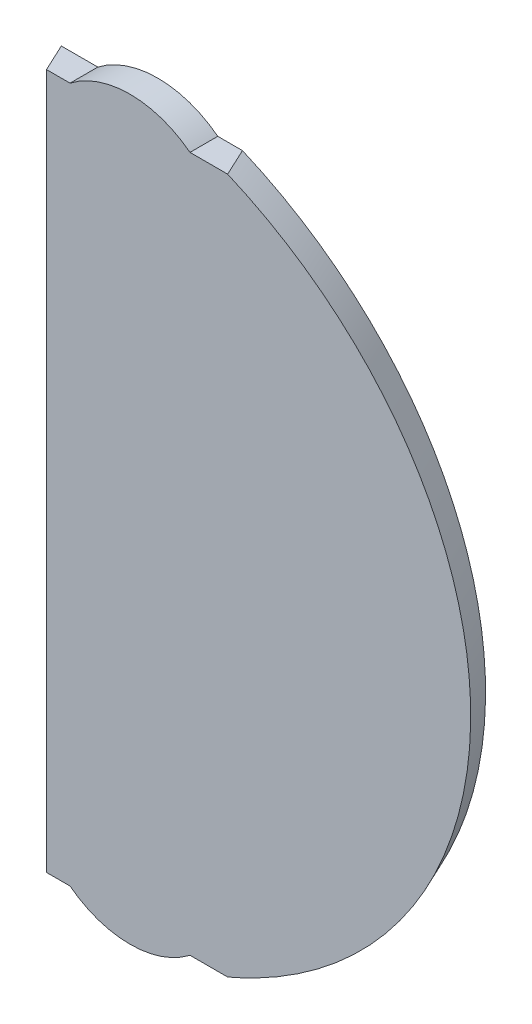
ISO-10303-21;
HEADER;
FILE_DESCRIPTION(('STEP AP214'),'2;1');
FILE_NAME('part.step','',(''),(''),'','','');
FILE_SCHEMA(('AUTOMOTIVE_DESIGN { 1 0 10303 214 1 1 1 1 }'));
ENDSEC;
DATA;
#1=APPLICATION_CONTEXT('core data for automotive mechanical design processes');
#2=APPLICATION_PROTOCOL_DEFINITION('international standard','automotive_design',2000,#1);
#3=PRODUCT_CONTEXT('',#1,'mechanical');
#4=PRODUCT('Part','Part','',(#3));
#5=PRODUCT_RELATED_PRODUCT_CATEGORY('part','',(#4));
#6=PRODUCT_DEFINITION_FORMATION('','',#4);
#7=PRODUCT_DEFINITION_CONTEXT('part definition',#1,'design');
#8=PRODUCT_DEFINITION('design','',#6,#7);
#9=PRODUCT_DEFINITION_SHAPE('','',#8);
#10=(LENGTH_UNIT() NAMED_UNIT(*) SI_UNIT(.MILLI.,.METRE.));
#11=(NAMED_UNIT(*) PLANE_ANGLE_UNIT() SI_UNIT($,.RADIAN.));
#12=(NAMED_UNIT(*) SI_UNIT($,.STERADIAN.) SOLID_ANGLE_UNIT());
#13=UNCERTAINTY_MEASURE_WITH_UNIT(LENGTH_MEASURE(1.E-05),#10,'distance_accuracy_value','');
#14=(GEOMETRIC_REPRESENTATION_CONTEXT(3) GLOBAL_UNCERTAINTY_ASSIGNED_CONTEXT((#13)) GLOBAL_UNIT_ASSIGNED_CONTEXT((#10,
#11,#12)) REPRESENTATION_CONTEXT('',''));
#15=CARTESIAN_POINT('',(0.,0.,0.));
#16=DIRECTION('',(0.,0.,1.));
#17=DIRECTION('',(1.,0.,0.));
#18=AXIS2_PLACEMENT_3D('',#15,#16,#17);
#19=CARTESIAN_POINT('',(10.4252922995726,10.795,0.431810345133612));
#20=DIRECTION('',(0.,-1.,0.));
#21=DIRECTION('',(-1.,0.,0.));
#22=AXIS2_PLACEMENT_3D('',#19,#20,#21);
#23=PLANE('',#22);
#24=DIRECTION('',(1.,0.,0.));
#25=VECTOR('',#24,1.);
#26=CARTESIAN_POINT('',(10.0225793579598,10.795,-0.431810345133612));
#27=LINE('',#26,#25);
#28=CARTESIAN_POINT('',(4.39823842454686,10.795,-0.431810345133612));
#29=VERTEX_POINT('',#28);
#30=CARTESIAN_POINT('',(5.53140935142909,10.795,-0.431810345133613));
#31=VERTEX_POINT('',#30);
#32=EDGE_CURVE('E126',#29,#31,#27,.T.);
#33=ORIENTED_EDGE('',*,*,#32,.F.);
#34=DIRECTION('',(-0.422618261740697,0.,-0.906307787036651));
#35=VECTOR('',#34,1.);
#36=CARTESIAN_POINT('',(4.80095136615957,10.795,0.431810345133612));
#37=LINE('',#36,#35);
#38=CARTESIAN_POINT('',(4.80095136615957,10.795,0.431810345133612));
#39=VERTEX_POINT('',#38);
#40=EDGE_CURVE('E144',#39,#29,#37,.T.);
#41=ORIENTED_EDGE('',*,*,#40,.F.);
#42=DIRECTION('',(1.,0.,0.));
#43=VECTOR('',#42,1.);
#44=CARTESIAN_POINT('',(10.4252922995726,10.795,0.431810345133612));
#45=LINE('',#44,#43);
#46=CARTESIAN_POINT('',(5.53140935142909,10.795,0.431810345133613));
#47=VERTEX_POINT('',#46);
#48=EDGE_CURVE('E128',#39,#47,#45,.T.);
#49=ORIENTED_EDGE('',*,*,#48,.T.);
#50=DIRECTION('',(0.,0.,-1.));
#51=VECTOR('',#50,1.);
#52=CARTESIAN_POINT('',(5.53140935142909,10.795,4.20992693941706));
#53=LINE('',#52,#51);
#54=EDGE_CURVE('E113',#47,#31,#53,.T.);
#55=ORIENTED_EDGE('',*,*,#54,.T.);
#56=EDGE_LOOP('',(#33,#41,#49,#55));
#57=FACE_BOUND('',#56,.T.);
#58=ADVANCED_FACE('F45',(#57),#23,.F.);
#59=CARTESIAN_POINT('',(4.80095136615957,-10.795,0.431810345133612));
#60=DIRECTION('',(0.,1.,0.));
#61=DIRECTION('',(0.,0.,1.));
#62=AXIS2_PLACEMENT_3D('',#59,#60,#61);
#63=PLANE('',#62);
#64=DIRECTION('',(-1.,0.,0.));
#65=VECTOR('',#64,1.);
#66=CARTESIAN_POINT('',(4.39823842454686,-10.795,-0.431810345133612));
#67=LINE('',#66,#65);
#68=CARTESIAN_POINT('',(10.0225793579598,-10.795,-0.431810345133612));
#69=VERTEX_POINT('',#68);
#70=CARTESIAN_POINT('',(9.25578043927734,-10.795,-0.431810345133613));
#71=VERTEX_POINT('',#70);
#72=EDGE_CURVE('E156',#69,#71,#67,.T.);
#73=ORIENTED_EDGE('',*,*,#72,.F.);
#74=DIRECTION('',(-0.422618261740697,0.,-0.906307787036651));
#75=VECTOR('',#74,1.);
#76=CARTESIAN_POINT('',(10.4252922995726,-10.795,0.431810345133612));
#77=LINE('',#76,#75);
#78=CARTESIAN_POINT('',(10.4252922995726,-10.795,0.431810345133612));
#79=VERTEX_POINT('',#78);
#80=EDGE_CURVE('E11',#79,#69,#77,.T.);
#81=ORIENTED_EDGE('',*,*,#80,.F.);
#82=DIRECTION('',(-1.,0.,0.));
#83=VECTOR('',#82,1.);
#84=CARTESIAN_POINT('',(4.80095136615957,-10.795,0.431810345133612));
#85=LINE('',#84,#83);
#86=CARTESIAN_POINT('',(9.25578043927734,-10.795,0.431810345133613));
#87=VERTEX_POINT('',#86);
#88=EDGE_CURVE('E164',#79,#87,#85,.T.);
#89=ORIENTED_EDGE('',*,*,#88,.T.);
#90=DIRECTION('',(0.,0.,-1.));
#91=VECTOR('',#90,1.);
#92=CARTESIAN_POINT('',(9.25578043927734,-10.795,4.20992693941706));
#93=LINE('',#92,#91);
#94=EDGE_CURVE('E168',#87,#71,#93,.T.);
#95=ORIENTED_EDGE('',*,*,#94,.T.);
#96=EDGE_LOOP('',(#73,#81,#89,#95));
#97=FACE_BOUND('',#96,.T.);
#98=ADVANCED_FACE('F179',(#97),#63,.F.);
#99=DIRECTION('',(0.,0.,-1.));
#100=VECTOR('',#99,1.);
#101=CARTESIAN_POINT('',(9.25578043927734,10.795,4.20992693941706));
#102=LINE('',#101,#100);
#103=CARTESIAN_POINT('',(9.25578043927734,10.795,0.431810345133612));
#104=VERTEX_POINT('',#103);
#105=CARTESIAN_POINT('',(9.25578043927734,10.795,-0.431810345133613));
#106=VERTEX_POINT('',#105);
#107=EDGE_CURVE('E116',#104,#106,#102,.T.);
#108=ORIENTED_EDGE('',*,*,#107,.F.);
#109=CARTESIAN_POINT('',(10.4252922995726,10.795,0.431810345133612));
#110=VERTEX_POINT('',#109);
#111=EDGE_CURVE('E162',#104,#110,#45,.T.);
#112=ORIENTED_EDGE('',*,*,#111,.T.);
#113=DIRECTION('',(-0.422618261740697,0.,-0.906307787036651));
#114=VECTOR('',#113,1.);
#115=CARTESIAN_POINT('',(10.4252922995726,10.795,0.431810345133612));
#116=LINE('',#115,#114);
#117=CARTESIAN_POINT('',(10.0225793579598,10.795,-0.431810345133612));
#118=VERTEX_POINT('',#117);
#119=EDGE_CURVE('E141',#110,#118,#116,.T.);
#120=ORIENTED_EDGE('',*,*,#119,.T.);
#121=EDGE_CURVE('E135',#106,#118,#27,.T.);
#122=ORIENTED_EDGE('',*,*,#121,.F.);
#123=EDGE_LOOP('',(#108,#112,#120,#122));
#124=FACE_BOUND('',#123,.T.);
#125=ADVANCED_FACE('F188',(#124),#23,.F.);
#126=DIRECTION('',(0.,0.,-1.));
#127=VECTOR('',#126,1.);
#128=CARTESIAN_POINT('',(5.53140935142909,-10.795,4.20992693941706));
#129=LINE('',#128,#127);
#130=CARTESIAN_POINT('',(5.53140935142909,-10.795,0.431810345133612));
#131=VERTEX_POINT('',#130);
#132=CARTESIAN_POINT('',(5.53140935142909,-10.795,-0.431810345133613));
#133=VERTEX_POINT('',#132);
#134=EDGE_CURVE('E171',#131,#133,#129,.T.);
#135=ORIENTED_EDGE('',*,*,#134,.F.);
#136=CARTESIAN_POINT('',(4.80095136615957,-10.795,0.431810345133612));
#137=VERTEX_POINT('',#136);
#138=EDGE_CURVE('E137',#131,#137,#85,.T.);
#139=ORIENTED_EDGE('',*,*,#138,.T.);
#140=DIRECTION('',(-0.422618261740697,0.,-0.906307787036651));
#141=VECTOR('',#140,1.);
#142=CARTESIAN_POINT('',(4.80095136615957,-10.795,0.431810345133612));
#143=LINE('',#142,#141);
#144=CARTESIAN_POINT('',(4.39823842454686,-10.795,-0.431810345133612));
#145=VERTEX_POINT('',#144);
#146=EDGE_CURVE('E54',#137,#145,#143,.T.);
#147=ORIENTED_EDGE('',*,*,#146,.T.);
#148=EDGE_CURVE('E152',#133,#145,#67,.T.);
#149=ORIENTED_EDGE('',*,*,#148,.F.);
#150=EDGE_LOOP('',(#135,#139,#147,#149));
#151=FACE_BOUND('',#150,.T.);
#152=ADVANCED_FACE('F151',(#151),#63,.F.);
#153=CARTESIAN_POINT('',(4.80095136615957,0.,0.431810345133612));
#154=DIRECTION('',(0.,0.,-1.));
#155=DIRECTION('',(1.,0.,0.));
#156=AXIS2_PLACEMENT_3D('',#153,#154,#155);
#157=ELLIPSE('',#156,13.172,11.938);
#158=DIRECTION('',(-0.422618261740697,0.,-0.906307787036651));
#159=VECTOR('',#158,1.);
#160=SURFACE_OF_LINEAR_EXTRUSION('',#157,#159);
#161=CARTESIAN_POINT('',(4.39823842454686,0.,-0.431810345133612));
#162=DIRECTION('',(0.,0.,-1.));
#163=DIRECTION('',(1.,0.,0.));
#164=AXIS2_PLACEMENT_3D('',#161,#162,#163);
#165=ELLIPSE('',#164,13.172,11.938);
#166=EDGE_CURVE('E158',#118,#69,#165,.T.);
#167=ORIENTED_EDGE('',*,*,#166,.F.);
#168=ORIENTED_EDGE('',*,*,#119,.F.);
#169=EDGE_CURVE('E134',#110,#79,#157,.T.);
#170=ORIENTED_EDGE('',*,*,#169,.T.);
#171=ORIENTED_EDGE('',*,*,#80,.T.);
#172=EDGE_LOOP('',(#167,#168,#170,#171));
#173=FACE_BOUND('',#172,.T.);
#174=ADVANCED_FACE('F47',(#173),#160,.T.);
#175=CARTESIAN_POINT('',(4.80095136615957,-10.795,0.431810345133612));
#176=DIRECTION('',(0.906307787036651,0.,-0.422618261740697));
#177=DIRECTION('',(0.422618261740697,0.,0.906307787036651));
#178=AXIS2_PLACEMENT_3D('',#175,#176,#177);
#179=PLANE('',#178);
#180=DIRECTION('',(0.,1.,0.));
#181=VECTOR('',#180,1.);
#182=CARTESIAN_POINT('',(4.39823842454686,-10.795,-0.431810345133612));
#183=LINE('',#182,#181);
#184=EDGE_CURVE('E132',#145,#29,#183,.T.);
#185=ORIENTED_EDGE('',*,*,#184,.F.);
#186=ORIENTED_EDGE('',*,*,#146,.F.);
#187=DIRECTION('',(0.,1.,0.));
#188=VECTOR('',#187,1.);
#189=CARTESIAN_POINT('',(4.80095136615957,-10.795,0.431810345133612));
#190=LINE('',#189,#188);
#191=EDGE_CURVE('E155',#137,#39,#190,.T.);
#192=ORIENTED_EDGE('',*,*,#191,.T.);
#193=ORIENTED_EDGE('',*,*,#40,.T.);
#194=EDGE_LOOP('',(#185,#186,#192,#193));
#195=FACE_BOUND('',#194,.T.);
#196=ADVANCED_FACE('F154',(#195),#179,.F.);
#197=CARTESIAN_POINT('',(4.80095136615957,0.,0.431810345133612));
#198=DIRECTION('',(0.,0.,1.));
#199=DIRECTION('',(-1.,0.,0.));
#200=AXIS2_PLACEMENT_3D('',#197,#198,#199);
#201=PLANE('',#200);
#202=ORIENTED_EDGE('',*,*,#169,.F.);
#203=ORIENTED_EDGE('',*,*,#111,.F.);
#204=CARTESIAN_POINT('',(7.39359489535321,8.38200000000002,0.431810345133613));
#205=DIRECTION('',(0.,0.,-1.));
#206=DIRECTION('',(-1.,0.,0.));
#207=AXIS2_PLACEMENT_3D('',#204,#205,#206);
#208=CIRCLE('',#207,3.048);
#209=EDGE_CURVE('E61',#47,#104,#208,.T.);
#210=ORIENTED_EDGE('',*,*,#209,.F.);
#211=ORIENTED_EDGE('',*,*,#48,.F.);
#212=ORIENTED_EDGE('',*,*,#191,.F.);
#213=ORIENTED_EDGE('',*,*,#138,.F.);
#214=CARTESIAN_POINT('',(7.39359489535321,-8.382,0.431810345133613));
#215=DIRECTION('',(0.,0.,-1.));
#216=DIRECTION('',(-1.,0.,0.));
#217=AXIS2_PLACEMENT_3D('',#214,#215,#216);
#218=CIRCLE('',#217,3.048);
#219=EDGE_CURVE('E69',#87,#131,#218,.T.);
#220=ORIENTED_EDGE('',*,*,#219,.F.);
#221=ORIENTED_EDGE('',*,*,#88,.F.);
#222=EDGE_LOOP('',(#202,#203,#210,#211,#212,#213,#220,#221));
#223=FACE_BOUND('',#222,.T.);
#224=ADVANCED_FACE('F186',(#223),#201,.T.);
#225=CARTESIAN_POINT('',(4.39823842454686,0.,-0.431810345133612));
#226=DIRECTION('',(0.,0.,1.));
#227=DIRECTION('',(-1.,0.,0.));
#228=AXIS2_PLACEMENT_3D('',#225,#226,#227);
#229=PLANE('',#228);
#230=ORIENTED_EDGE('',*,*,#166,.T.);
#231=ORIENTED_EDGE('',*,*,#72,.T.);
#232=CARTESIAN_POINT('',(7.39359489535321,-8.382,-0.431810345133613));
#233=DIRECTION('',(0.,0.,-1.));
#234=DIRECTION('',(-1.,0.,0.));
#235=AXIS2_PLACEMENT_3D('',#232,#233,#234);
#236=CIRCLE('',#235,3.048);
#237=EDGE_CURVE('E121',#133,#71,#236,.F.);
#238=ORIENTED_EDGE('',*,*,#237,.F.);
#239=ORIENTED_EDGE('',*,*,#148,.T.);
#240=ORIENTED_EDGE('',*,*,#184,.T.);
#241=ORIENTED_EDGE('',*,*,#32,.T.);
#242=CARTESIAN_POINT('',(7.39359489535321,8.38200000000002,-0.431810345133613));
#243=DIRECTION('',(0.,0.,-1.));
#244=DIRECTION('',(-1.,0.,0.));
#245=AXIS2_PLACEMENT_3D('',#242,#243,#244);
#246=CIRCLE('',#245,3.048);
#247=EDGE_CURVE('E110',#106,#31,#246,.F.);
#248=ORIENTED_EDGE('',*,*,#247,.F.);
#249=ORIENTED_EDGE('',*,*,#121,.T.);
#250=EDGE_LOOP('',(#230,#231,#238,#239,#240,#241,#248,#249));
#251=FACE_BOUND('',#250,.T.);
#252=ADVANCED_FACE('F130',(#251),#229,.F.);
#253=CARTESIAN_POINT('',(7.39359489535321,-8.382,4.20992693941706));
#254=DIRECTION('',(0.,0.,-1.));
#255=DIRECTION('',(1.,0.,0.));
#256=AXIS2_PLACEMENT_3D('',#253,#254,#255);
#257=CYLINDRICAL_SURFACE('',#256,3.048);
#258=ORIENTED_EDGE('',*,*,#219,.T.);
#259=ORIENTED_EDGE('',*,*,#134,.T.);
#260=ORIENTED_EDGE('',*,*,#237,.T.);
#261=ORIENTED_EDGE('',*,*,#94,.F.);
#262=EDGE_LOOP('',(#258,#259,#260,#261));
#263=FACE_BOUND('',#262,.T.);
#264=ADVANCED_FACE('F176',(#263),#257,.T.);
#265=CARTESIAN_POINT('',(7.39359489535321,8.38200000000002,4.20992693941706));
#266=DIRECTION('',(0.,0.,-1.));
#267=DIRECTION('',(1.,0.,0.));
#268=AXIS2_PLACEMENT_3D('',#265,#266,#267);
#269=CYLINDRICAL_SURFACE('',#268,3.048);
#270=ORIENTED_EDGE('',*,*,#209,.T.);
#271=ORIENTED_EDGE('',*,*,#107,.T.);
#272=ORIENTED_EDGE('',*,*,#247,.T.);
#273=ORIENTED_EDGE('',*,*,#54,.F.);
#274=EDGE_LOOP('',(#270,#271,#272,#273));
#275=FACE_BOUND('',#274,.T.);
#276=ADVANCED_FACE('F112',(#275),#269,.T.);
#277=CLOSED_SHELL('',(#58,#98,#125,#152,#174,#196,#224,#252,#264,#276));
#278=MANIFOLD_SOLID_BREP('B2',#277);
#279=ADVANCED_BREP_SHAPE_REPRESENTATION('',(#18,#278),#14);
#280=SHAPE_DEFINITION_REPRESENTATION(#9,#279);
ENDSEC;
END-ISO-10303-21;
